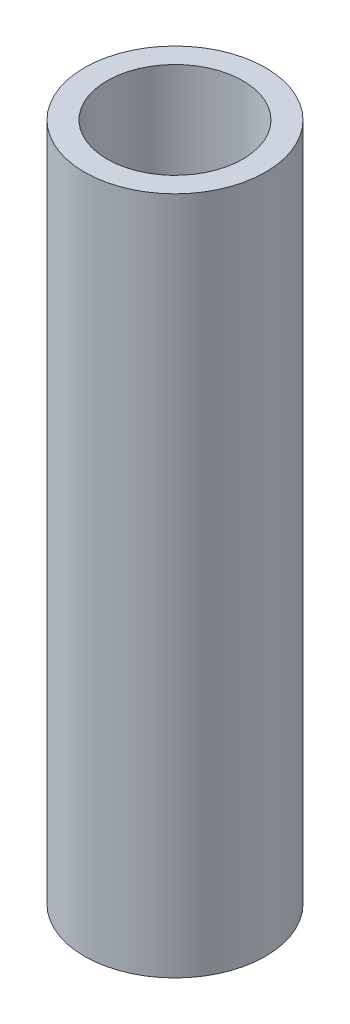
ISO-10303-21;
HEADER;
FILE_DESCRIPTION(('STEP AP214'),'2;1');
FILE_NAME('part.step','',(''),(''),'','','');
FILE_SCHEMA(('AUTOMOTIVE_DESIGN { 1 0 10303 214 1 1 1 1 }'));
ENDSEC;
DATA;
#1=APPLICATION_CONTEXT('core data for automotive mechanical design processes');
#2=APPLICATION_PROTOCOL_DEFINITION('international standard','automotive_design',2000,#1);
#3=PRODUCT_CONTEXT('',#1,'mechanical');
#4=PRODUCT('Part','Part','',(#3));
#5=PRODUCT_RELATED_PRODUCT_CATEGORY('part','',(#4));
#6=PRODUCT_DEFINITION_FORMATION('','',#4);
#7=PRODUCT_DEFINITION_CONTEXT('part definition',#1,'design');
#8=PRODUCT_DEFINITION('design','',#6,#7);
#9=PRODUCT_DEFINITION_SHAPE('','',#8);
#10=(LENGTH_UNIT() NAMED_UNIT(*) SI_UNIT(.MILLI.,.METRE.));
#11=(NAMED_UNIT(*) PLANE_ANGLE_UNIT() SI_UNIT($,.RADIAN.));
#12=(NAMED_UNIT(*) SI_UNIT($,.STERADIAN.) SOLID_ANGLE_UNIT());
#13=UNCERTAINTY_MEASURE_WITH_UNIT(LENGTH_MEASURE(1.E-05),#10,'distance_accuracy_value','');
#14=(GEOMETRIC_REPRESENTATION_CONTEXT(3) GLOBAL_UNCERTAINTY_ASSIGNED_CONTEXT((#13)) GLOBAL_UNIT_ASSIGNED_CONTEXT((#10,
#11,#12)) REPRESENTATION_CONTEXT('',''));
#15=CARTESIAN_POINT('',(0.,0.,0.));
#16=DIRECTION('',(0.,0.,1.));
#17=DIRECTION('',(1.,0.,0.));
#18=AXIS2_PLACEMENT_3D('',#15,#16,#17);
#19=CARTESIAN_POINT('',(0.,30.,0.));
#20=DIRECTION('',(0.,1.,0.));
#21=DIRECTION('',(0.,0.,1.));
#22=AXIS2_PLACEMENT_3D('',#19,#20,#21);
#23=PLANE('',#22);
#24=CARTESIAN_POINT('',(0.,30.,0.));
#25=DIRECTION('',(0.,1.,0.));
#26=DIRECTION('',(0.,0.,1.));
#27=AXIS2_PLACEMENT_3D('',#24,#25,#26);
#28=CIRCLE('',#27,4.);
#29=CARTESIAN_POINT('',(0.,30.,4.));
#30=VERTEX_POINT('',#29);
#31=EDGE_CURVE('E10',#30,#30,#28,.T.);
#32=ORIENTED_EDGE('',*,*,#31,.T.);
#33=EDGE_LOOP('',(#32));
#34=FACE_BOUND('',#33,.T.);
#35=CARTESIAN_POINT('',(0.,30.,0.));
#36=DIRECTION('',(0.,1.,0.));
#37=DIRECTION('',(0.,0.,1.));
#38=AXIS2_PLACEMENT_3D('',#35,#36,#37);
#39=CIRCLE('',#38,3.);
#40=CARTESIAN_POINT('',(0.,30.,3.));
#41=VERTEX_POINT('',#40);
#42=EDGE_CURVE('E44',#41,#41,#39,.T.);
#43=ORIENTED_EDGE('',*,*,#42,.F.);
#44=EDGE_LOOP('',(#43));
#45=FACE_BOUND('',#44,.T.);
#46=ADVANCED_FACE('F33',(#34,#45),#23,.T.);
#47=CARTESIAN_POINT('',(0.,0.,0.));
#48=DIRECTION('',(0.,1.,0.));
#49=DIRECTION('',(0.,0.,1.));
#50=AXIS2_PLACEMENT_3D('',#47,#48,#49);
#51=PLANE('',#50);
#52=CARTESIAN_POINT('',(0.,0.,0.));
#53=DIRECTION('',(0.,1.,0.));
#54=DIRECTION('',(0.,0.,1.));
#55=AXIS2_PLACEMENT_3D('',#52,#53,#54);
#56=CIRCLE('',#55,4.);
#57=CARTESIAN_POINT('',(0.,0.,4.));
#58=VERTEX_POINT('',#57);
#59=EDGE_CURVE('E37',#58,#58,#56,.T.);
#60=ORIENTED_EDGE('',*,*,#59,.F.);
#61=EDGE_LOOP('',(#60));
#62=FACE_BOUND('',#61,.T.);
#63=CARTESIAN_POINT('',(0.,0.,0.));
#64=DIRECTION('',(0.,1.,0.));
#65=DIRECTION('',(0.,0.,1.));
#66=AXIS2_PLACEMENT_3D('',#63,#64,#65);
#67=CIRCLE('',#66,3.);
#68=CARTESIAN_POINT('',(0.,0.,3.));
#69=VERTEX_POINT('',#68);
#70=EDGE_CURVE('E46',#69,#69,#67,.T.);
#71=ORIENTED_EDGE('',*,*,#70,.T.);
#72=EDGE_LOOP('',(#71));
#73=FACE_BOUND('',#72,.T.);
#74=ADVANCED_FACE('F56',(#62,#73),#51,.F.);
#75=CARTESIAN_POINT('',(0.,30.,0.));
#76=DIRECTION('',(0.,-1.,0.));
#77=DIRECTION('',(0.,0.,-1.));
#78=AXIS2_PLACEMENT_3D('',#75,#76,#77);
#79=CYLINDRICAL_SURFACE('',#78,4.);
#80=ORIENTED_EDGE('',*,*,#31,.F.);
#81=EDGE_LOOP('',(#80));
#82=FACE_BOUND('',#81,.T.);
#83=ORIENTED_EDGE('',*,*,#59,.T.);
#84=EDGE_LOOP('',(#83));
#85=FACE_BOUND('',#84,.T.);
#86=ADVANCED_FACE('F35',(#82,#85),#79,.T.);
#87=CARTESIAN_POINT('',(0.,30.,0.));
#88=DIRECTION('',(0.,-1.,0.));
#89=DIRECTION('',(0.,0.,-1.));
#90=AXIS2_PLACEMENT_3D('',#87,#88,#89);
#91=CYLINDRICAL_SURFACE('',#90,3.);
#92=ORIENTED_EDGE('',*,*,#42,.T.);
#93=EDGE_LOOP('',(#92));
#94=FACE_BOUND('',#93,.T.);
#95=ORIENTED_EDGE('',*,*,#70,.F.);
#96=EDGE_LOOP('',(#95));
#97=FACE_BOUND('',#96,.T.);
#98=ADVANCED_FACE('F52',(#94,#97),#91,.F.);
#99=CLOSED_SHELL('',(#46,#74,#86,#98));
#100=MANIFOLD_SOLID_BREP('B2',#99);
#101=ADVANCED_BREP_SHAPE_REPRESENTATION('',(#18,#100),#14);
#102=SHAPE_DEFINITION_REPRESENTATION(#9,#101);
ENDSEC;
END-ISO-10303-21;
